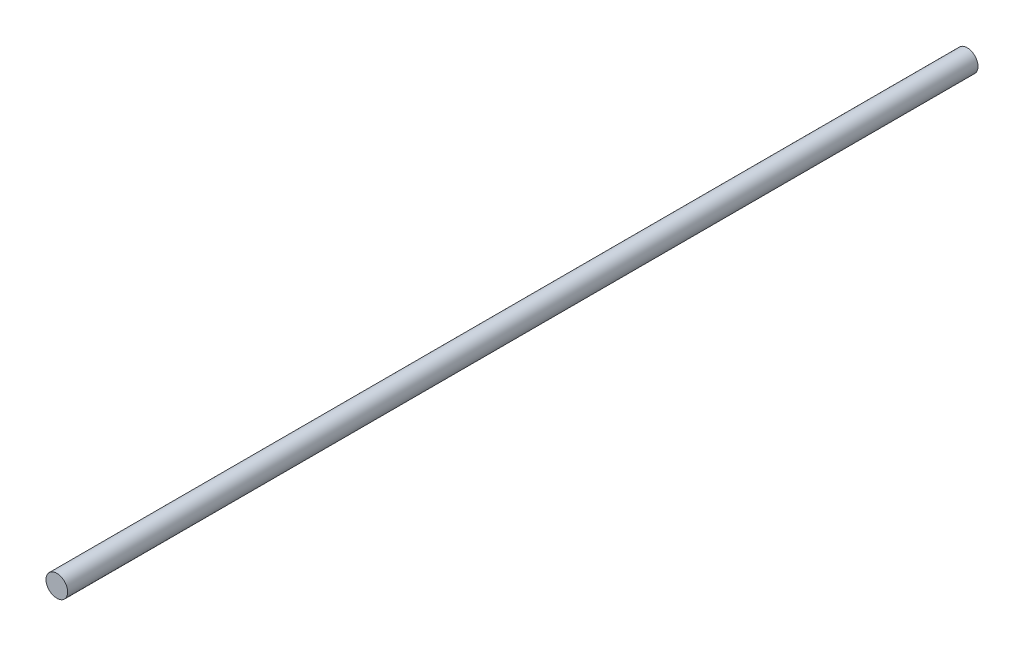
ISO-10303-21;
HEADER;
FILE_DESCRIPTION(('STEP AP214'),'2;1');
FILE_NAME('part.step','',(''),(''),'','','');
FILE_SCHEMA(('AUTOMOTIVE_DESIGN { 1 0 10303 214 1 1 1 1 }'));
ENDSEC;
DATA;
#1=APPLICATION_CONTEXT('core data for automotive mechanical design processes');
#2=APPLICATION_PROTOCOL_DEFINITION('international standard','automotive_design',2000,#1);
#3=PRODUCT_CONTEXT('',#1,'mechanical');
#4=PRODUCT('Part','Part','',(#3));
#5=PRODUCT_RELATED_PRODUCT_CATEGORY('part','',(#4));
#6=PRODUCT_DEFINITION_FORMATION('','',#4);
#7=PRODUCT_DEFINITION_CONTEXT('part definition',#1,'design');
#8=PRODUCT_DEFINITION('design','',#6,#7);
#9=PRODUCT_DEFINITION_SHAPE('','',#8);
#10=(LENGTH_UNIT() NAMED_UNIT(*) SI_UNIT(.MILLI.,.METRE.));
#11=(NAMED_UNIT(*) PLANE_ANGLE_UNIT() SI_UNIT($,.RADIAN.));
#12=(NAMED_UNIT(*) SI_UNIT($,.STERADIAN.) SOLID_ANGLE_UNIT());
#13=UNCERTAINTY_MEASURE_WITH_UNIT(LENGTH_MEASURE(1.E-05),#10,'distance_accuracy_value','');
#14=(GEOMETRIC_REPRESENTATION_CONTEXT(3) GLOBAL_UNCERTAINTY_ASSIGNED_CONTEXT((#13)) GLOBAL_UNIT_ASSIGNED_CONTEXT((#10,
#11,#12)) REPRESENTATION_CONTEXT('',''));
#15=CARTESIAN_POINT('',(0.,0.,0.));
#16=DIRECTION('',(0.,0.,1.));
#17=DIRECTION('',(1.,0.,0.));
#18=AXIS2_PLACEMENT_3D('',#15,#16,#17);
#19=CARTESIAN_POINT('',(0.,0.,336.));
#20=DIRECTION('',(0.,0.,-1.));
#21=DIRECTION('',(-1.,0.,0.));
#22=AXIS2_PLACEMENT_3D('',#19,#20,#21);
#23=CYLINDRICAL_SURFACE('',#22,4.);
#24=CARTESIAN_POINT('',(0.,0.,336.));
#25=DIRECTION('',(0.,0.,1.));
#26=DIRECTION('',(1.,0.,0.));
#27=AXIS2_PLACEMENT_3D('',#24,#25,#26);
#28=CIRCLE('',#27,4.);
#29=CARTESIAN_POINT('',(-4.,0.,336.));
#30=VERTEX_POINT('',#29);
#31=EDGE_CURVE('E10',#30,#30,#28,.T.);
#32=CARTESIAN_POINT('',(0.,0.,0.));
#33=DIRECTION('',(0.,0.,1.));
#34=DIRECTION('',(1.,0.,0.));
#35=AXIS2_PLACEMENT_3D('',#32,#33,#34);
#36=CIRCLE('',#35,4.);
#37=CARTESIAN_POINT('',(-4.,0.,0.));
#38=VERTEX_POINT('',#37);
#39=EDGE_CURVE('E38',#38,#38,#36,.T.);
#40=CARTESIAN_POINT('',(-4.,0.,336.));
#41=CARTESIAN_POINT('',(-4.,0.,332.5));
#42=CARTESIAN_POINT('',(-4.,0.,329.));
#43=CARTESIAN_POINT('',(-4.,0.,322.));
#44=CARTESIAN_POINT('',(-4.,0.,318.5));
#45=CARTESIAN_POINT('',(-4.,0.,311.5));
#46=CARTESIAN_POINT('',(-4.,0.,308.));
#47=CARTESIAN_POINT('',(-4.,0.,301.));
#48=CARTESIAN_POINT('',(-4.,0.,297.5));
#49=CARTESIAN_POINT('',(-4.,0.,290.5));
#50=CARTESIAN_POINT('',(-4.,0.,287.));
#51=CARTESIAN_POINT('',(-4.,0.,280.));
#52=CARTESIAN_POINT('',(-4.,0.,276.5));
#53=CARTESIAN_POINT('',(-4.,0.,269.5));
#54=CARTESIAN_POINT('',(-4.,0.,266.));
#55=CARTESIAN_POINT('',(-4.,0.,259.));
#56=CARTESIAN_POINT('',(-4.,0.,255.5));
#57=CARTESIAN_POINT('',(-4.,0.,248.5));
#58=CARTESIAN_POINT('',(-4.,0.,245.));
#59=CARTESIAN_POINT('',(-4.,0.,238.));
#60=CARTESIAN_POINT('',(-4.,0.,234.5));
#61=CARTESIAN_POINT('',(-4.,0.,227.5));
#62=CARTESIAN_POINT('',(-4.,0.,224.));
#63=CARTESIAN_POINT('',(-4.,0.,217.));
#64=CARTESIAN_POINT('',(-4.,0.,213.5));
#65=CARTESIAN_POINT('',(-4.,0.,206.5));
#66=CARTESIAN_POINT('',(-4.,0.,203.));
#67=CARTESIAN_POINT('',(-4.,0.,196.));
#68=CARTESIAN_POINT('',(-4.,0.,192.5));
#69=CARTESIAN_POINT('',(-4.,0.,185.5));
#70=CARTESIAN_POINT('',(-4.,0.,182.));
#71=CARTESIAN_POINT('',(-4.,0.,175.));
#72=CARTESIAN_POINT('',(-4.,0.,171.5));
#73=CARTESIAN_POINT('',(-4.,0.,164.5));
#74=CARTESIAN_POINT('',(-4.,0.,161.));
#75=CARTESIAN_POINT('',(-4.,0.,154.));
#76=CARTESIAN_POINT('',(-4.,0.,150.5));
#77=CARTESIAN_POINT('',(-4.,0.,143.5));
#78=CARTESIAN_POINT('',(-4.,0.,140.));
#79=CARTESIAN_POINT('',(-4.,0.,133.));
#80=CARTESIAN_POINT('',(-4.,0.,129.5));
#81=CARTESIAN_POINT('',(-4.,0.,122.5));
#82=CARTESIAN_POINT('',(-4.,0.,119.));
#83=CARTESIAN_POINT('',(-4.,0.,112.));
#84=CARTESIAN_POINT('',(-4.,0.,108.5));
#85=CARTESIAN_POINT('',(-4.,0.,101.5));
#86=CARTESIAN_POINT('',(-4.,0.,98.));
#87=CARTESIAN_POINT('',(-4.,0.,91.));
#88=CARTESIAN_POINT('',(-4.,0.,87.5));
#89=CARTESIAN_POINT('',(-4.,0.,80.5));
#90=CARTESIAN_POINT('',(-4.,0.,77.));
#91=CARTESIAN_POINT('',(-4.,0.,70.));
#92=CARTESIAN_POINT('',(-4.,0.,66.5));
#93=CARTESIAN_POINT('',(-4.,0.,59.5));
#94=CARTESIAN_POINT('',(-4.,0.,56.));
#95=CARTESIAN_POINT('',(-4.,0.,49.));
#96=CARTESIAN_POINT('',(-4.,0.,45.5));
#97=CARTESIAN_POINT('',(-4.,0.,38.5));
#98=CARTESIAN_POINT('',(-4.,0.,35.));
#99=CARTESIAN_POINT('',(-4.,0.,28.));
#100=CARTESIAN_POINT('',(-4.,0.,24.5));
#101=CARTESIAN_POINT('',(-4.,0.,17.5));
#102=CARTESIAN_POINT('',(-4.,0.,14.));
#103=CARTESIAN_POINT('',(-4.,0.,7.));
#104=CARTESIAN_POINT('',(-4.,0.,3.5));
#105=CARTESIAN_POINT('',(-4.,0.,0.));
#106=B_SPLINE_CURVE_WITH_KNOTS('',3,(#40,#41,#42,#43,#44,#45,#46,#47,#48,#49,#50,#51,#52,#53,
#54,#55,#56,#57,#58,#59,#60,#61,#62,#63,#64,#65,#66,#67,#68,#69,#70,#71,#72,#73,#74,#75,#76,#77,
#78,#79,#80,#81,#82,#83,#84,#85,#86,#87,#88,#89,#90,#91,#92,#93,#94,#95,#96,#97,#98,#99,#100,
#101,#102,#103,#104,#105),.UNSPECIFIED.,.F.,.F.,(4,2,2,2,2,2,2,2,2,2,2,2,2,2,2,2,2,2,2,2,2,2,2,
2,2,2,2,2,2,2,2,2,4),(0.,10.5,21.,31.5,42.,52.5,63.,73.5,84.,94.5,105.,115.5,126.,136.5,147.,
157.5,168.,178.5,189.,199.5,210.,220.5,231.,241.5,252.,262.5,273.,283.5,294.,304.5,315.,325.5,
336.),.UNSPECIFIED.);
#107=EDGE_CURVE('BSEAM35',#30,#38,#106,.T.);
#108=ORIENTED_EDGE('',*,*,#31,.F.);
#109=ORIENTED_EDGE('',*,*,#39,.T.);
#110=ORIENTED_EDGE('',*,*,#107,.T.);
#111=ORIENTED_EDGE('',*,*,#107,.F.);
#112=EDGE_LOOP('',(#108,#110,#109,#111));
#113=FACE_BOUND('',#112,.T.);
#114=ADVANCED_FACE('F35',(#113),#23,.T.);
#115=CARTESIAN_POINT('',(0.,0.,336.));
#116=DIRECTION('',(0.,0.,1.));
#117=DIRECTION('',(1.,0.,0.));
#118=AXIS2_PLACEMENT_3D('',#115,#116,#117);
#119=PLANE('',#118);
#120=ORIENTED_EDGE('',*,*,#31,.T.);
#121=EDGE_LOOP('',(#120));
#122=FACE_BOUND('',#121,.T.);
#123=ADVANCED_FACE('F50',(#122),#119,.T.);
#124=CARTESIAN_POINT('',(0.,0.,0.));
#125=DIRECTION('',(0.,0.,1.));
#126=DIRECTION('',(1.,0.,0.));
#127=AXIS2_PLACEMENT_3D('',#124,#125,#126);
#128=PLANE('',#127);
#129=ORIENTED_EDGE('',*,*,#39,.F.);
#130=EDGE_LOOP('',(#129));
#131=FACE_BOUND('',#130,.T.);
#132=ADVANCED_FACE('F48',(#131),#128,.F.);
#133=CLOSED_SHELL('',(#114,#123,#132));
#134=MANIFOLD_SOLID_BREP('B2',#133);
#135=ADVANCED_BREP_SHAPE_REPRESENTATION('',(#18,#134),#14);
#136=SHAPE_DEFINITION_REPRESENTATION(#9,#135);
ENDSEC;
END-ISO-10303-21;
